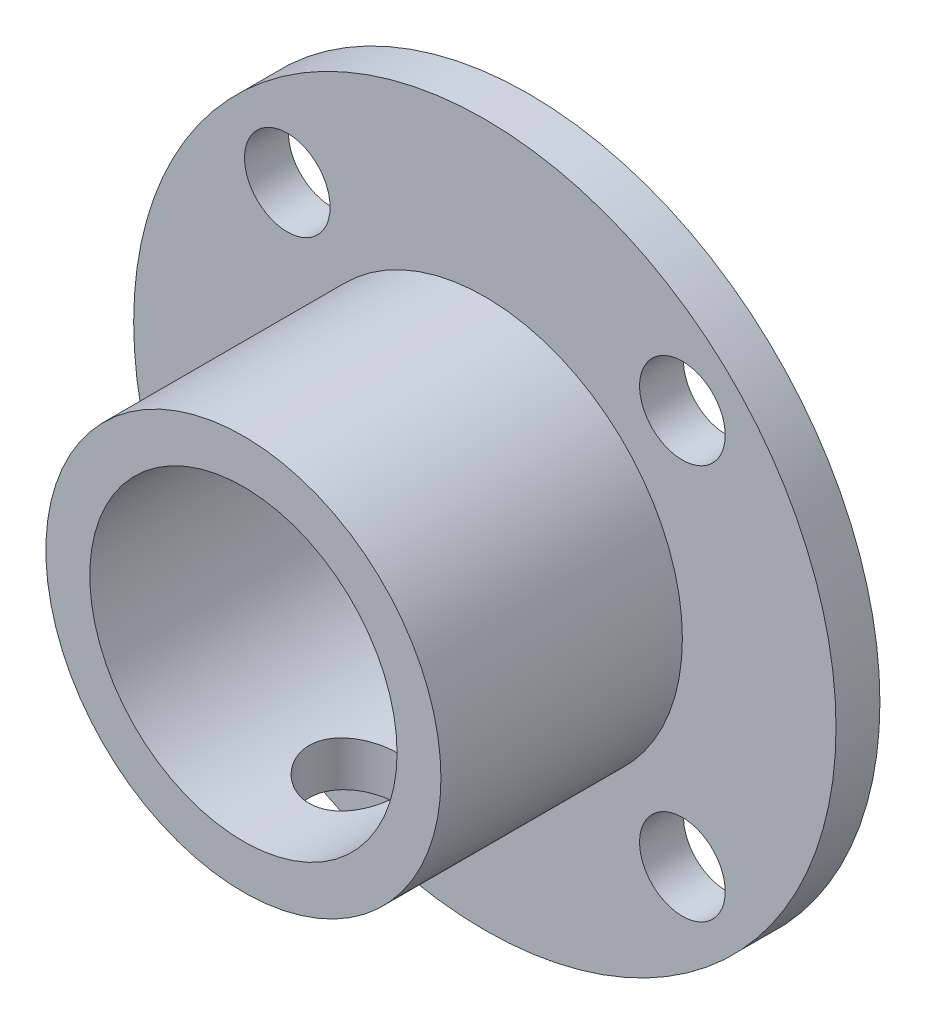
ISO-10303-21;
HEADER;
FILE_DESCRIPTION(('STEP AP214'),'2;1');
FILE_NAME('part.step','',(''),(''),'','','');
FILE_SCHEMA(('AUTOMOTIVE_DESIGN { 1 0 10303 214 1 1 1 1 }'));
ENDSEC;
DATA;
#1=APPLICATION_CONTEXT('core data for automotive mechanical design processes');
#2=APPLICATION_PROTOCOL_DEFINITION('international standard','automotive_design',2000,#1);
#3=PRODUCT_CONTEXT('',#1,'mechanical');
#4=PRODUCT('Part','Part','',(#3));
#5=PRODUCT_RELATED_PRODUCT_CATEGORY('part','',(#4));
#6=PRODUCT_DEFINITION_FORMATION('','',#4);
#7=PRODUCT_DEFINITION_CONTEXT('part definition',#1,'design');
#8=PRODUCT_DEFINITION('design','',#6,#7);
#9=PRODUCT_DEFINITION_SHAPE('','',#8);
#10=(LENGTH_UNIT() NAMED_UNIT(*) SI_UNIT(.MILLI.,.METRE.));
#11=(NAMED_UNIT(*) PLANE_ANGLE_UNIT() SI_UNIT($,.RADIAN.));
#12=(NAMED_UNIT(*) SI_UNIT($,.STERADIAN.) SOLID_ANGLE_UNIT());
#13=UNCERTAINTY_MEASURE_WITH_UNIT(LENGTH_MEASURE(1.E-05),#10,'distance_accuracy_value','');
#14=(GEOMETRIC_REPRESENTATION_CONTEXT(3) GLOBAL_UNCERTAINTY_ASSIGNED_CONTEXT((#13)) GLOBAL_UNIT_ASSIGNED_CONTEXT((#10,
#11,#12)) REPRESENTATION_CONTEXT('',''));
#15=CARTESIAN_POINT('',(0.,0.,0.));
#16=DIRECTION('',(0.,0.,1.));
#17=DIRECTION('',(1.,0.,0.));
#18=AXIS2_PLACEMENT_3D('',#15,#16,#17);
#19=CARTESIAN_POINT('',(0.,0.,2.));
#20=DIRECTION('',(0.,0.,-1.));
#21=DIRECTION('',(-1.,0.,0.));
#22=AXIS2_PLACEMENT_3D('',#19,#20,#21);
#23=CYLINDRICAL_SURFACE('',#22,16.);
#24=CARTESIAN_POINT('',(0.,0.,2.));
#25=DIRECTION('',(0.,0.,1.));
#26=DIRECTION('',(1.,0.,0.));
#27=AXIS2_PLACEMENT_3D('',#24,#25,#26);
#28=CIRCLE('',#27,16.);
#29=CARTESIAN_POINT('',(16.,0.,2.));
#30=VERTEX_POINT('',#29);
#31=EDGE_CURVE('E10',#30,#30,#28,.T.);
#32=ORIENTED_EDGE('',*,*,#31,.F.);
#33=EDGE_LOOP('',(#32));
#34=FACE_BOUND('',#33,.T.);
#35=CARTESIAN_POINT('',(0.,0.,0.));
#36=DIRECTION('',(0.,0.,1.));
#37=DIRECTION('',(1.,0.,0.));
#38=AXIS2_PLACEMENT_3D('',#35,#36,#37);
#39=CIRCLE('',#38,16.);
#40=CARTESIAN_POINT('',(16.,0.,0.));
#41=VERTEX_POINT('',#40);
#42=EDGE_CURVE('E72',#41,#41,#39,.T.);
#43=ORIENTED_EDGE('',*,*,#42,.T.);
#44=EDGE_LOOP('',(#43));
#45=FACE_BOUND('',#44,.T.);
#46=ADVANCED_FACE('F37',(#34,#45),#23,.T.);
#47=CARTESIAN_POINT('',(-9.,-9.,2.));
#48=DIRECTION('',(0.,0.,-1.));
#49=DIRECTION('',(-1.,0.,0.));
#50=AXIS2_PLACEMENT_3D('',#47,#48,#49);
#51=CYLINDRICAL_SURFACE('',#50,1.95);
#52=CARTESIAN_POINT('',(-9.,-9.,2.));
#53=DIRECTION('',(0.,0.,1.));
#54=DIRECTION('',(1.,0.,0.));
#55=AXIS2_PLACEMENT_3D('',#52,#53,#54);
#56=CIRCLE('',#55,1.95);
#57=CARTESIAN_POINT('',(-7.05,-9.,2.));
#58=VERTEX_POINT('',#57);
#59=EDGE_CURVE('E50',#58,#58,#56,.T.);
#60=ORIENTED_EDGE('',*,*,#59,.T.);
#61=EDGE_LOOP('',(#60));
#62=FACE_BOUND('',#61,.T.);
#63=CARTESIAN_POINT('',(-9.,-9.,0.));
#64=DIRECTION('',(0.,0.,1.));
#65=DIRECTION('',(1.,0.,0.));
#66=AXIS2_PLACEMENT_3D('',#63,#64,#65);
#67=CIRCLE('',#66,1.95);
#68=CARTESIAN_POINT('',(-7.05,-9.,0.));
#69=VERTEX_POINT('',#68);
#70=EDGE_CURVE('E69',#69,#69,#67,.T.);
#71=ORIENTED_EDGE('',*,*,#70,.F.);
#72=EDGE_LOOP('',(#71));
#73=FACE_BOUND('',#72,.T.);
#74=ADVANCED_FACE('F103',(#62,#73),#51,.F.);
#75=CARTESIAN_POINT('',(9.,-9.,2.));
#76=DIRECTION('',(0.,0.,-1.));
#77=DIRECTION('',(-1.,0.,0.));
#78=AXIS2_PLACEMENT_3D('',#75,#76,#77);
#79=CYLINDRICAL_SURFACE('',#78,1.95);
#80=CARTESIAN_POINT('',(9.,-9.,2.));
#81=DIRECTION('',(0.,0.,1.));
#82=DIRECTION('',(1.,0.,0.));
#83=AXIS2_PLACEMENT_3D('',#80,#81,#82);
#84=CIRCLE('',#83,1.95);
#85=CARTESIAN_POINT('',(10.95,-9.,2.));
#86=VERTEX_POINT('',#85);
#87=EDGE_CURVE('E55',#86,#86,#84,.T.);
#88=ORIENTED_EDGE('',*,*,#87,.T.);
#89=EDGE_LOOP('',(#88));
#90=FACE_BOUND('',#89,.T.);
#91=CARTESIAN_POINT('',(9.,-9.,0.));
#92=DIRECTION('',(0.,0.,1.));
#93=DIRECTION('',(1.,0.,0.));
#94=AXIS2_PLACEMENT_3D('',#91,#92,#93);
#95=CIRCLE('',#94,1.95);
#96=CARTESIAN_POINT('',(10.95,-9.,0.));
#97=VERTEX_POINT('',#96);
#98=EDGE_CURVE('E66',#97,#97,#95,.T.);
#99=ORIENTED_EDGE('',*,*,#98,.F.);
#100=EDGE_LOOP('',(#99));
#101=FACE_BOUND('',#100,.T.);
#102=ADVANCED_FACE('F91',(#90,#101),#79,.F.);
#103=CARTESIAN_POINT('',(9.,9.,2.));
#104=DIRECTION('',(0.,0.,-1.));
#105=DIRECTION('',(-1.,0.,0.));
#106=AXIS2_PLACEMENT_3D('',#103,#104,#105);
#107=CYLINDRICAL_SURFACE('',#106,1.95);
#108=CARTESIAN_POINT('',(9.,9.,2.));
#109=DIRECTION('',(0.,0.,1.));
#110=DIRECTION('',(1.,0.,0.));
#111=AXIS2_PLACEMENT_3D('',#108,#109,#110);
#112=CIRCLE('',#111,1.95);
#113=CARTESIAN_POINT('',(10.95,9.,2.));
#114=VERTEX_POINT('',#113);
#115=EDGE_CURVE('E80',#114,#114,#112,.T.);
#116=ORIENTED_EDGE('',*,*,#115,.T.);
#117=EDGE_LOOP('',(#116));
#118=FACE_BOUND('',#117,.T.);
#119=CARTESIAN_POINT('',(9.,9.,0.));
#120=DIRECTION('',(0.,0.,1.));
#121=DIRECTION('',(1.,0.,0.));
#122=AXIS2_PLACEMENT_3D('',#119,#120,#121);
#123=CIRCLE('',#122,1.95);
#124=CARTESIAN_POINT('',(10.95,9.,0.));
#125=VERTEX_POINT('',#124);
#126=EDGE_CURVE('E62',#125,#125,#123,.T.);
#127=ORIENTED_EDGE('',*,*,#126,.F.);
#128=EDGE_LOOP('',(#127));
#129=FACE_BOUND('',#128,.T.);
#130=ADVANCED_FACE('F125',(#118,#129),#107,.F.);
#131=CARTESIAN_POINT('',(-9.,9.,2.));
#132=DIRECTION('',(0.,0.,-1.));
#133=DIRECTION('',(-1.,0.,0.));
#134=AXIS2_PLACEMENT_3D('',#131,#132,#133);
#135=CYLINDRICAL_SURFACE('',#134,1.95);
#136=CARTESIAN_POINT('',(-9.,9.,2.));
#137=DIRECTION('',(0.,0.,1.));
#138=DIRECTION('',(1.,0.,0.));
#139=AXIS2_PLACEMENT_3D('',#136,#137,#138);
#140=CIRCLE('',#139,1.95);
#141=CARTESIAN_POINT('',(-7.05,9.,2.));
#142=VERTEX_POINT('',#141);
#143=EDGE_CURVE('E76',#142,#142,#140,.T.);
#144=ORIENTED_EDGE('',*,*,#143,.T.);
#145=EDGE_LOOP('',(#144));
#146=FACE_BOUND('',#145,.T.);
#147=CARTESIAN_POINT('',(-9.,9.,0.));
#148=DIRECTION('',(0.,0.,1.));
#149=DIRECTION('',(1.,0.,0.));
#150=AXIS2_PLACEMENT_3D('',#147,#148,#149);
#151=CIRCLE('',#150,1.95);
#152=CARTESIAN_POINT('',(-7.05,9.,0.));
#153=VERTEX_POINT('',#152);
#154=EDGE_CURVE('E59',#153,#153,#151,.T.);
#155=ORIENTED_EDGE('',*,*,#154,.F.);
#156=EDGE_LOOP('',(#155));
#157=FACE_BOUND('',#156,.T.);
#158=ADVANCED_FACE('F39',(#146,#157),#135,.F.);
#159=CARTESIAN_POINT('',(0.,0.,2.));
#160=DIRECTION('',(0.,0.,-1.));
#161=DIRECTION('',(-1.,0.,0.));
#162=AXIS2_PLACEMENT_3D('',#159,#160,#161);
#163=CYLINDRICAL_SURFACE('',#162,7.);
#164=CARTESIAN_POINT('',(0.,-7.,10.));
#165=CARTESIAN_POINT('',(0.109954902377251,-6.99999869294341,9.99999806043805));
#166=CARTESIAN_POINT('',(0.219929747872581,-6.99738417402043,9.99090221102388));
#167=CARTESIAN_POINT('',(0.436691991196989,-6.98720905945103,9.95483572989769));
#168=CARTESIAN_POINT('',(0.543478166829615,-6.97964659210084,9.92785833392591));
#169=CARTESIAN_POINT('',(0.750704300737871,-6.96040691349073,9.85699196158349));
#170=CARTESIAN_POINT('',(0.851152880848224,-6.94873544106341,9.81312656384805));
#171=CARTESIAN_POINT('',(1.04326876112927,-6.92249978316544,9.70982200852165));
#172=CARTESIAN_POINT('',(1.13493514117816,-6.90793529508022,9.65038122150964));
#173=CARTESIAN_POINT('',(1.30929444685895,-6.8770473462558,9.51596498932709));
#174=CARTESIAN_POINT('',(1.39172372238094,-6.86069041945191,9.44065524614473));
#175=CARTESIAN_POINT('',(1.54297135792435,-6.82826734915641,9.27735225686232));
#176=CARTESIAN_POINT('',(1.61178767707782,-6.81220124959344,9.18935711236777));
#177=CARTESIAN_POINT('',(1.7351979000643,-6.78183014875388,9.00100641720909));
#178=CARTESIAN_POINT('',(1.78947821103348,-6.76756702506018,8.90043801493514));
#179=CARTESIAN_POINT('',(1.8802517055398,-6.74291343840667,8.69112798824924));
#180=CARTESIAN_POINT('',(1.91674871555719,-6.73252214244871,8.58238812792911));
#181=CARTESIAN_POINT('',(1.96998433013875,-6.71713608196016,8.36276523683446));
#182=CARTESIAN_POINT('',(1.9872055320285,-6.71200978570011,8.25200863723216));
#183=CARTESIAN_POINT('',(2.00290667789184,-6.70734208201995,8.0290688515539));
#184=CARTESIAN_POINT('',(2.00139069409621,-6.70779946107612,7.91688598074978));
#185=CARTESIAN_POINT('',(1.98004134762903,-6.71413034409934,7.69813138854384));
#186=CARTESIAN_POINT('',(1.96080325728391,-6.71982782697936,7.59149564881924));
#187=CARTESIAN_POINT('',(1.90551386085789,-6.73571348382811,7.3830327803724));
#188=CARTESIAN_POINT('',(1.8694610348125,-6.74590206376403,7.2812060872795));
#189=CARTESIAN_POINT('',(1.78110681137812,-6.7697686351608,7.08375375556819));
#190=CARTESIAN_POINT('',(1.72860551172881,-6.78348916405649,6.98822292759833));
#191=CARTESIAN_POINT('',(1.60898379167885,-6.81285216882059,6.80712343878659));
#192=CARTESIAN_POINT('',(1.54186011673345,-6.82849507221912,6.72155700226509));
#193=CARTESIAN_POINT('',(1.39190399673021,-6.86066250656356,6.55942762439363));
#194=CARTESIAN_POINT('',(1.30857487484533,-6.87719804572366,6.48332552403277));
#195=CARTESIAN_POINT('',(1.13013228238622,-6.90876247218345,6.34607399635972));
#196=CARTESIAN_POINT('',(1.03501820148189,-6.92379128137825,6.28492534395829));
#197=CARTESIAN_POINT('',(0.834923073091444,-6.95076528065502,6.17907126522596));
#198=CARTESIAN_POINT('',(0.729889817810004,-6.96269275497229,6.13445971319581));
#199=CARTESIAN_POINT('',(0.513393229967468,-6.98199251487585,6.06366610858318));
#200=CARTESIAN_POINT('',(0.401931525810145,-6.98936594856255,6.03747941075473));
#201=CARTESIAN_POINT('',(0.179666388644349,-6.99854874514672,6.00502671429055));
#202=CARTESIAN_POINT('',(0.0689613468605073,-7.00053272850599,5.99813530462697));
#203=CARTESIAN_POINT('',(-0.152026526805584,-6.99922084707091,6.00272726630104));
#204=CARTESIAN_POINT('',(-0.262309407757109,-6.99592561580629,6.01420843284592));
#205=CARTESIAN_POINT('',(-0.477018633430315,-6.98453926685206,6.05471044431625));
#206=CARTESIAN_POINT('',(-0.581518211734843,-6.97654613017679,6.08337318132339));
#207=CARTESIAN_POINT('',(-0.78420868620564,-6.95667998741883,6.15700050198467));
#208=CARTESIAN_POINT('',(-0.882398851248717,-6.94480653265874,6.20196697088933));
#209=CARTESIAN_POINT('',(-1.07204168512003,-6.91809961169145,6.30802333664512));
#210=CARTESIAN_POINT('',(-1.16330248654009,-6.9032076317834,6.36944119882533));
#211=CARTESIAN_POINT('',(-1.33443852805947,-6.87217947098441,6.5062525059511));
#212=CARTESIAN_POINT('',(-1.41431117084304,-6.85604300755107,6.58164913006457));
#213=CARTESIAN_POINT('',(-1.56310642834007,-6.82368619629443,6.74720934204944));
#214=CARTESIAN_POINT('',(-1.63158542740713,-6.80748036858305,6.83777527555905));
#215=CARTESIAN_POINT('',(-1.75239531606757,-6.77738894734786,7.02946258862467));
#216=CARTESIAN_POINT('',(-1.8047267674867,-6.76350327310608,7.13058360077126));
#217=CARTESIAN_POINT('',(-1.89137454118278,-6.73978651242836,7.34009121097521));
#218=CARTESIAN_POINT('',(-1.92578633239654,-6.72993400029434,7.44843576349761));
#219=CARTESIAN_POINT('',(-1.9757945006787,-6.71542456669526,7.66970993557479));
#220=CARTESIAN_POINT('',(-1.99139657901587,-6.71076607094366,7.78263815507641));
#221=CARTESIAN_POINT('',(-2.00298024246851,-6.70731703127619,8.00529603293678));
#222=CARTESIAN_POINT('',(-1.99968027644405,-6.70831160808103,8.11498550455666));
#223=CARTESIAN_POINT('',(-1.97524710957466,-6.71554597206102,8.33217473066169));
#224=CARTESIAN_POINT('',(-1.95411450379873,-6.72178558421114,8.43967455809192));
#225=CARTESIAN_POINT('',(-1.89505968816675,-6.73866977160527,8.6483783711686));
#226=CARTESIAN_POINT('',(-1.85731091786365,-6.74926877048974,8.74963538701117));
#227=CARTESIAN_POINT('',(-1.76622949301581,-6.77367302842112,8.9444587344922));
#228=CARTESIAN_POINT('',(-1.71289408043152,-6.78747885482392,9.03802370127323));
#229=CARTESIAN_POINT('',(-1.59006546534828,-6.81731668949935,9.21818352180533));
#230=CARTESIAN_POINT('',(-1.52009227722732,-6.83340763179064,9.30444139134196));
#231=CARTESIAN_POINT('',(-1.36685984037934,-6.86569845092232,9.46422389580981));
#232=CARTESIAN_POINT('',(-1.28359725072856,-6.88189835417168,9.5377453191108));
#233=CARTESIAN_POINT('',(-1.10357432086539,-6.91307959572365,9.67183718432662));
#234=CARTESIAN_POINT('',(-1.00652250235978,-6.92801901037413,9.73202698726963));
#235=CARTESIAN_POINT('',(-0.803250529646661,-6.95451395777971,9.83514578502201));
#236=CARTESIAN_POINT('',(-0.697035424114739,-6.96607133870287,9.87808421193306));
#237=CARTESIAN_POINT('',(-0.492916315335035,-6.98327344725308,9.94084755139545));
#238=CARTESIAN_POINT('',(-0.395763007624391,-6.98949684362076,9.96297353668456));
#239=CARTESIAN_POINT('',(-0.199078368786368,-6.99786043852147,9.99254965724214));
#240=CARTESIAN_POINT('',(-0.099547357616092,-7.00000118333996,10.0000017559769));
#241=CARTESIAN_POINT('',(0.,-7.,10.));
#242=B_SPLINE_CURVE_WITH_KNOTS('',3,(#164,#165,#166,#167,#168,#169,#170,#171,#172,#173,#174,
#175,#176,#177,#178,#179,#180,#181,#182,#183,#184,#185,#186,#187,#188,#189,#190,#191,#192,#193,
#194,#195,#196,#197,#198,#199,#200,#201,#202,#203,#204,#205,#206,#207,#208,#209,#210,#211,#212,
#213,#214,#215,#216,#217,#218,#219,#220,#221,#222,#223,#224,#225,#226,#227,#228,#229,#230,#231,
#232,#233,#234,#235,#236,#237,#238,#239,#240,#241),.UNSPECIFIED.,.T.,.F.,(4,2,2,2,2,2,2,2,2,2,2,
2,2,2,2,2,2,2,2,2,2,2,2,2,2,2,2,2,2,2,2,2,2,2,2,2,2,2,4),(0.,0.329499312542344,0.65912333979518,
0.988288812895344,1.31748873543516,1.65447811530781,1.99151797873713,2.33533075300057,
2.67906951544809,3.0139950986275,3.34884789231233,3.67284785829333,3.99687711786126,
4.3250080329121,4.65321205577343,4.99378500602502,5.33437560155449,5.67687101104449,
6.01928004014612,6.350454576982,6.68158937434648,7.00605140479519,7.33055096575529,
7.66207525344451,7.99367503187788,8.33612104884334,8.67855514965298,9.01914573366138,
9.35963305787734,9.68726681616472,10.0148896418598,10.3391709629126,10.6635096999758,
10.9986765689036,11.3339278310847,11.6777797897016,12.0214434923409,12.3197946803794,
12.6181059442772),.UNSPECIFIED.);
#243=CARTESIAN_POINT('',(0.,-7.,10.));
#244=VERTEX_POINT('',#243);
#245=EDGE_CURVE('E151',#244,#244,#242,.T.);
#246=ORIENTED_EDGE('',*,*,#245,.F.);
#247=EDGE_LOOP('',(#246));
#248=FACE_BOUND('',#247,.T.);
#249=CARTESIAN_POINT('',(0.,0.,0.));
#250=DIRECTION('',(0.,0.,1.));
#251=DIRECTION('',(1.,0.,0.));
#252=AXIS2_PLACEMENT_3D('',#249,#250,#251);
#253=CIRCLE('',#252,7.);
#254=CARTESIAN_POINT('',(7.,0.,0.));
#255=VERTEX_POINT('',#254);
#256=EDGE_CURVE('E74',#255,#255,#253,.T.);
#257=ORIENTED_EDGE('',*,*,#256,.F.);
#258=EDGE_LOOP('',(#257));
#259=FACE_BOUND('',#258,.T.);
#260=CARTESIAN_POINT('',(0.,0.,13.));
#261=DIRECTION('',(0.,0.,1.));
#262=DIRECTION('',(1.,0.,0.));
#263=AXIS2_PLACEMENT_3D('',#260,#261,#262);
#264=CIRCLE('',#263,7.);
#265=CARTESIAN_POINT('',(7.,0.,13.));
#266=VERTEX_POINT('',#265);
#267=EDGE_CURVE('E155',#266,#266,#264,.T.);
#268=ORIENTED_EDGE('',*,*,#267,.T.);
#269=EDGE_LOOP('',(#268));
#270=FACE_BOUND('',#269,.T.);
#271=ADVANCED_FACE('F98',(#248,#259,#270),#163,.F.);
#272=CARTESIAN_POINT('',(0.,0.,2.));
#273=DIRECTION('',(0.,0.,1.));
#274=DIRECTION('',(1.,0.,0.));
#275=AXIS2_PLACEMENT_3D('',#272,#273,#274);
#276=PLANE('',#275);
#277=CARTESIAN_POINT('',(0.,0.,2.));
#278=DIRECTION('',(0.,0.,1.));
#279=DIRECTION('',(1.,0.,0.));
#280=AXIS2_PLACEMENT_3D('',#277,#278,#279);
#281=CIRCLE('',#280,9.);
#282=CARTESIAN_POINT('',(9.,0.,2.));
#283=VERTEX_POINT('',#282);
#284=EDGE_CURVE('E63',#283,#283,#281,.F.);
#285=ORIENTED_EDGE('',*,*,#284,.T.);
#286=EDGE_LOOP('',(#285));
#287=FACE_BOUND('',#286,.T.);
#288=ORIENTED_EDGE('',*,*,#143,.F.);
#289=EDGE_LOOP('',(#288));
#290=FACE_BOUND('',#289,.T.);
#291=ORIENTED_EDGE('',*,*,#115,.F.);
#292=EDGE_LOOP('',(#291));
#293=FACE_BOUND('',#292,.T.);
#294=ORIENTED_EDGE('',*,*,#87,.F.);
#295=EDGE_LOOP('',(#294));
#296=FACE_BOUND('',#295,.T.);
#297=ORIENTED_EDGE('',*,*,#59,.F.);
#298=EDGE_LOOP('',(#297));
#299=FACE_BOUND('',#298,.T.);
#300=ORIENTED_EDGE('',*,*,#31,.T.);
#301=EDGE_LOOP('',(#300));
#302=FACE_BOUND('',#301,.T.);
#303=ADVANCED_FACE('F94',(#287,#290,#293,#296,#299,#302),#276,.T.);
#304=CARTESIAN_POINT('',(0.,0.,0.));
#305=DIRECTION('',(0.,0.,1.));
#306=DIRECTION('',(1.,0.,0.));
#307=AXIS2_PLACEMENT_3D('',#304,#305,#306);
#308=PLANE('',#307);
#309=ORIENTED_EDGE('',*,*,#154,.T.);
#310=EDGE_LOOP('',(#309));
#311=FACE_BOUND('',#310,.T.);
#312=ORIENTED_EDGE('',*,*,#126,.T.);
#313=EDGE_LOOP('',(#312));
#314=FACE_BOUND('',#313,.T.);
#315=ORIENTED_EDGE('',*,*,#98,.T.);
#316=EDGE_LOOP('',(#315));
#317=FACE_BOUND('',#316,.T.);
#318=ORIENTED_EDGE('',*,*,#70,.T.);
#319=EDGE_LOOP('',(#318));
#320=FACE_BOUND('',#319,.T.);
#321=ORIENTED_EDGE('',*,*,#42,.F.);
#322=EDGE_LOOP('',(#321));
#323=FACE_BOUND('',#322,.T.);
#324=ORIENTED_EDGE('',*,*,#256,.T.);
#325=EDGE_LOOP('',(#324));
#326=FACE_BOUND('',#325,.T.);
#327=ADVANCED_FACE('F97',(#311,#314,#317,#320,#323,#326),#308,.F.);
#328=CARTESIAN_POINT('',(0.,0.,13.));
#329=DIRECTION('',(0.,0.,-1.));
#330=DIRECTION('',(-1.,0.,0.));
#331=AXIS2_PLACEMENT_3D('',#328,#329,#330);
#332=CYLINDRICAL_SURFACE('',#331,9.);
#333=CARTESIAN_POINT('',(0.,-9.,10.));
#334=CARTESIAN_POINT('',(0.110880476775648,-8.99999796218252,9.99999627632018));
#335=CARTESIAN_POINT('',(0.22180556526962,-8.99793013995692,9.99074801833651));
#336=CARTESIAN_POINT('',(0.440501944103134,-8.9898809775767,9.95403952764945));
#337=CARTESIAN_POINT('',(0.548270975138987,-8.98389690217348,9.92656656599071));
#338=CARTESIAN_POINT('',(0.757463277761528,-8.96868113169008,9.85431402950835));
#339=CARTESIAN_POINT('',(0.858893152100285,-8.95945288439083,9.80955282300213));
#340=CARTESIAN_POINT('',(1.05280018031376,-8.93874335441378,9.7040533875276));
#341=CARTESIAN_POINT('',(1.14527750793335,-8.92726211547358,9.64331546870939));
#342=CARTESIAN_POINT('',(1.32018631401403,-8.9030909417421,9.50652433489332));
#343=CARTESIAN_POINT('',(1.40244861204353,-8.89038561641427,9.43025749786486));
#344=CARTESIAN_POINT('',(1.55312491045837,-8.86530601079787,9.26503193990686));
#345=CARTESIAN_POINT('',(1.62153764410855,-8.85293176088049,9.17607205928954));
#346=CARTESIAN_POINT('',(1.7433244341035,-8.82976328261711,8.9867281559417));
#347=CARTESIAN_POINT('',(1.79651742104403,-8.81898875742981,8.88622504195847));
#348=CARTESIAN_POINT('',(1.88519298954508,-8.80046096352395,8.67742723830758));
#349=CARTESIAN_POINT('',(1.92067776220096,-8.79270732104771,8.56913351449575));
#350=CARTESIAN_POINT('',(1.97236858006404,-8.78125609459189,8.34966652267733));
#351=CARTESIAN_POINT('',(1.98887467038069,-8.77749545807783,8.23856728489457));
#352=CARTESIAN_POINT('',(2.00307270997673,-8.77426673730669,8.0151177822138));
#353=CARTESIAN_POINT('',(2.00076704911663,-8.77479810778939,7.90276767803785));
#354=CARTESIAN_POINT('',(1.97764827517302,-8.78003632148146,7.6822433728062));
#355=CARTESIAN_POINT('',(1.95718464460217,-8.78466431384841,7.57403037586065));
#356=CARTESIAN_POINT('',(1.89888490681146,-8.79744954191676,7.362612856675));
#357=CARTESIAN_POINT('',(1.86104779681652,-8.80560698133176,7.2594086239146));
#358=CARTESIAN_POINT('',(1.76875672872875,-8.82460909970296,7.05996056161812));
#359=CARTESIAN_POINT('',(1.71416919379353,-8.8354752436249,6.96378067266393));
#360=CARTESIAN_POINT('',(1.5900206813985,-8.85865737910744,6.78181712948411));
#361=CARTESIAN_POINT('',(1.52045760074274,-8.87097357420597,6.69603493817985));
#362=CARTESIAN_POINT('',(1.36648683702983,-8.89600574612666,6.53529069065153));
#363=CARTESIAN_POINT('',(1.28178220526623,-8.90872450687872,6.46061321489494));
#364=CARTESIAN_POINT('',(1.10090661809162,-8.93287839122317,6.32647627109288));
#365=CARTESIAN_POINT('',(1.00473544183737,-8.94431349008427,6.2670170962181));
#366=CARTESIAN_POINT('',(0.803303190734734,-8.96465064233607,6.16493072422319));
#367=CARTESIAN_POINT('',(0.698022122319854,-8.97354693007659,6.12234175569174));
#368=CARTESIAN_POINT('',(0.481555930981456,-8.98776136366255,6.05553898694213));
#369=CARTESIAN_POINT('',(0.370371697593365,-8.99308004696785,6.03132242658587));
#370=CARTESIAN_POINT('',(0.147695483280845,-8.99946317761673,6.00236798674483));
#371=CARTESIAN_POINT('',(0.0362563973189049,-9.0006124862229,5.99724149983832));
#372=CARTESIAN_POINT('',(-0.18588592392808,-8.99876558650597,6.00555810426037));
#373=CARTESIAN_POINT('',(-0.296589210270646,-8.9957696689046,6.01899989331945));
#374=CARTESIAN_POINT('',(-0.512823257329421,-8.98602258758613,6.0637494151681));
#375=CARTESIAN_POINT('',(-0.618398491715483,-8.97931447007761,6.09485245622345));
#376=CARTESIAN_POINT('',(-0.822832805855831,-8.96289421086795,6.17381368744508));
#377=CARTESIAN_POINT('',(-0.921691300010177,-8.95318180764659,6.22167333630601));
#378=CARTESIAN_POINT('',(-1.11148643989438,-8.9316215322764,6.33359287679898));
#379=CARTESIAN_POINT('',(-1.20228573083225,-8.91974444590247,6.39787994300616));
#380=CARTESIAN_POINT('',(-1.37194696498812,-8.8952303234908,6.54053124910144));
#381=CARTESIAN_POINT('',(-1.45080730173413,-8.88259318550175,6.6188973803321));
#382=CARTESIAN_POINT('',(-1.59589548190985,-8.8576887894581,6.7892680335807));
#383=CARTESIAN_POINT('',(-1.66185381940073,-8.84543317664284,6.8815040900066));
#384=CARTESIAN_POINT('',(-1.77734611922752,-8.82295395378308,7.07597203441081));
#385=CARTESIAN_POINT('',(-1.82688079926974,-8.8127302549527,7.1782034853421));
#386=CARTESIAN_POINT('',(-1.90778001896259,-8.79557200548926,7.38920828910514));
#387=CARTESIAN_POINT('',(-1.93924786354759,-8.78861879659786,7.49794044226884));
#388=CARTESIAN_POINT('',(-1.98342027658406,-8.77875649697392,7.71932418486247));
#389=CARTESIAN_POINT('',(-1.99612795718356,-8.77584673547331,7.83197512102595));
#390=CARTESIAN_POINT('',(-2.00228356641044,-8.77444401448977,8.05527887827833));
#391=CARTESIAN_POINT('',(-1.99615913143933,-8.77585298370124,8.16591950806006));
#392=CARTESIAN_POINT('',(-1.96578277121688,-8.78270664957547,8.38454970996682));
#393=CARTESIAN_POINT('',(-1.94153107400239,-8.78815129547033,8.49253931542349));
#394=CARTESIAN_POINT('',(-1.87579819980744,-8.80241428131525,8.70244912022738));
#395=CARTESIAN_POINT('',(-1.83438116628454,-8.81122005182769,8.8043903168816));
#396=CARTESIAN_POINT('',(-1.73554770348342,-8.83121764469058,8.99993999254673));
#397=CARTESIAN_POINT('',(-1.67812954585193,-8.84240972476633,9.09354756996401));
#398=CARTESIAN_POINT('',(-1.54751358990558,-8.8662104283533,9.27187660894797));
#399=CARTESIAN_POINT('',(-1.47401185511038,-8.8788437136774,9.35637220492265));
#400=CARTESIAN_POINT('',(-1.31392870594504,-8.90393974173387,9.51197007393133));
#401=CARTESIAN_POINT('',(-1.22734426623344,-8.91640244429053,9.58306924050841));
#402=CARTESIAN_POINT('',(-1.04214597064557,-8.93995259726581,9.71077598291992));
#403=CARTESIAN_POINT('',(-0.94338563663495,-8.95101923499229,9.76717519973493));
#404=CARTESIAN_POINT('',(-0.737560279778819,-8.97032058369249,9.86248330418121));
#405=CARTESIAN_POINT('',(-0.630502203312995,-8.97855763270815,9.90140664004617));
#406=CARTESIAN_POINT('',(-0.436138247729409,-8.98982812909554,9.95384135027679));
#407=CARTESIAN_POINT('',(-0.349871991901682,-8.9936186902321,9.97111737366629));
#408=CARTESIAN_POINT('',(-0.175746449894528,-8.99870537459789,9.99419790430615));
#409=CARTESIAN_POINT('',(-0.0878872388928783,-9.00000161523612,10.0000029515019));
#410=CARTESIAN_POINT('',(0.,-9.,10.));
#411=B_SPLINE_CURVE_WITH_KNOTS('',3,(#333,#334,#335,#336,#337,#338,#339,#340,#341,#342,#343,
#344,#345,#346,#347,#348,#349,#350,#351,#352,#353,#354,#355,#356,#357,#358,#359,#360,#361,#362,
#363,#364,#365,#366,#367,#368,#369,#370,#371,#372,#373,#374,#375,#376,#377,#378,#379,#380,#381,
#382,#383,#384,#385,#386,#387,#388,#389,#390,#391,#392,#393,#394,#395,#396,#397,#398,#399,#400,
#401,#402,#403,#404,#405,#406,#407,#408,#409,#410),.UNSPECIFIED.,.T.,.F.,(4,2,2,2,2,2,2,2,2,2,2,
2,2,2,2,2,2,2,2,2,2,2,2,2,2,2,2,2,2,2,2,2,2,2,2,2,2,2,4),(0.,0.332319689729797,
0.664871731249283,0.997071412407459,1.32926464516989,1.66638072002079,2.00352761490514,
2.34453296297976,2.6854961068774,3.02099125638107,3.35644378496591,3.68557668145784,
4.0147285774694,4.34657669709581,4.678471452583,5.01778179808977,5.35709867969828,
5.69718012811237,6.03721047501988,6.37027992124269,6.70332600912267,7.03258869425167,
7.36188004945459,7.69599803262041,8.03016093387756,8.37069473105728,8.71121364510411,
9.04976559055243,9.38826136686411,9.71912785142416,10.0499901738286,10.3796271201578,
10.7092996858639,11.0458432631282,11.3824647846641,11.7236258704957,12.0645043787094,
12.3279234735856,12.5913301688795),.UNSPECIFIED.);
#412=CARTESIAN_POINT('',(0.,-9.,10.));
#413=VERTEX_POINT('',#412);
#414=EDGE_CURVE('E41',#413,#413,#411,.T.);
#415=ORIENTED_EDGE('',*,*,#414,.T.);
#416=EDGE_LOOP('',(#415));
#417=FACE_BOUND('',#416,.T.);
#418=ORIENTED_EDGE('',*,*,#284,.F.);
#419=EDGE_LOOP('',(#418));
#420=FACE_BOUND('',#419,.T.);
#421=CARTESIAN_POINT('',(0.,0.,13.));
#422=DIRECTION('',(0.,0.,1.));
#423=DIRECTION('',(1.,0.,0.));
#424=AXIS2_PLACEMENT_3D('',#421,#422,#423);
#425=CIRCLE('',#424,9.);
#426=CARTESIAN_POINT('',(9.,0.,13.));
#427=VERTEX_POINT('',#426);
#428=EDGE_CURVE('E157',#427,#427,#425,.T.);
#429=ORIENTED_EDGE('',*,*,#428,.F.);
#430=EDGE_LOOP('',(#429));
#431=FACE_BOUND('',#430,.T.);
#432=ADVANCED_FACE('F111',(#417,#420,#431),#332,.T.);
#433=CARTESIAN_POINT('',(0.,0.,13.));
#434=DIRECTION('',(0.,0.,1.));
#435=DIRECTION('',(1.,0.,0.));
#436=AXIS2_PLACEMENT_3D('',#433,#434,#435);
#437=PLANE('',#436);
#438=ORIENTED_EDGE('',*,*,#267,.F.);
#439=EDGE_LOOP('',(#438));
#440=FACE_BOUND('',#439,.T.);
#441=ORIENTED_EDGE('',*,*,#428,.T.);
#442=EDGE_LOOP('',(#441));
#443=FACE_BOUND('',#442,.T.);
#444=ADVANCED_FACE('F168',(#440,#443),#437,.T.);
#445=CARTESIAN_POINT('',(0.,-13.,8.));
#446=DIRECTION('',(0.,1.,0.));
#447=DIRECTION('',(0.,0.,1.));
#448=AXIS2_PLACEMENT_3D('',#445,#446,#447);
#449=CYLINDRICAL_SURFACE('',#448,2.);
#450=ORIENTED_EDGE('',*,*,#245,.T.);
#451=EDGE_LOOP('',(#450));
#452=FACE_BOUND('',#451,.T.);
#453=ORIENTED_EDGE('',*,*,#414,.F.);
#454=EDGE_LOOP('',(#453));
#455=FACE_BOUND('',#454,.T.);
#456=ADVANCED_FACE('F164',(#452,#455),#449,.F.);
#457=CLOSED_SHELL('',(#46,#74,#102,#130,#158,#271,#303,#327,#432,#444,#456));
#458=MANIFOLD_SOLID_BREP('B2',#457);
#459=ADVANCED_BREP_SHAPE_REPRESENTATION('',(#18,#458),#14);
#460=SHAPE_DEFINITION_REPRESENTATION(#9,#459);
ENDSEC;
END-ISO-10303-21;
